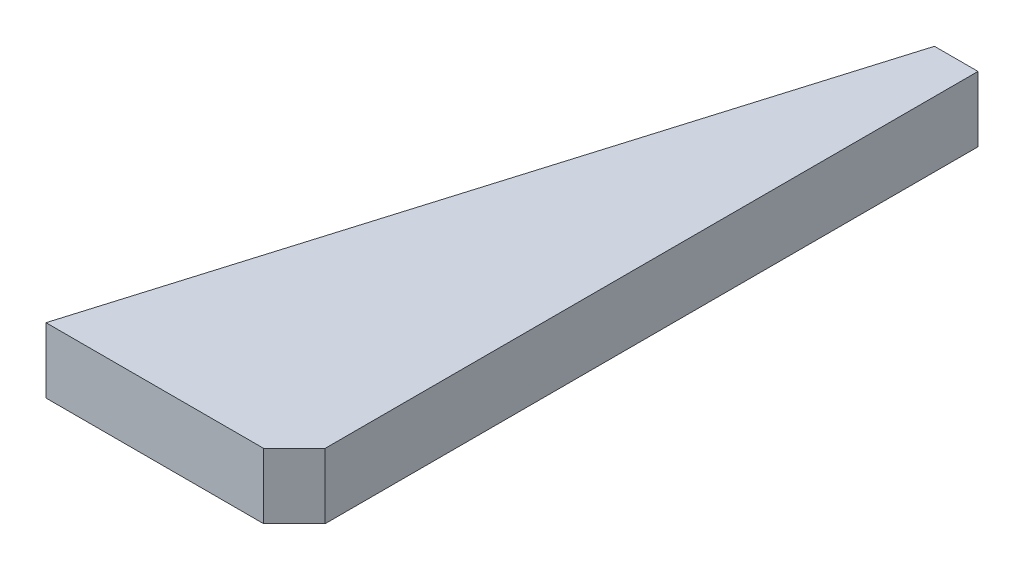
ISO-10303-21;
HEADER;
FILE_DESCRIPTION(('STEP AP214'),'2;1');
FILE_NAME('part.step','',(''),(''),'','','');
FILE_SCHEMA(('AUTOMOTIVE_DESIGN { 1 0 10303 214 1 1 1 1 }'));
ENDSEC;
DATA;
#1=APPLICATION_CONTEXT('core data for automotive mechanical design processes');
#2=APPLICATION_PROTOCOL_DEFINITION('international standard','automotive_design',2000,#1);
#3=PRODUCT_CONTEXT('',#1,'mechanical');
#4=PRODUCT('Part','Part','',(#3));
#5=PRODUCT_RELATED_PRODUCT_CATEGORY('part','',(#4));
#6=PRODUCT_DEFINITION_FORMATION('','',#4);
#7=PRODUCT_DEFINITION_CONTEXT('part definition',#1,'design');
#8=PRODUCT_DEFINITION('design','',#6,#7);
#9=PRODUCT_DEFINITION_SHAPE('','',#8);
#10=(LENGTH_UNIT() NAMED_UNIT(*) SI_UNIT(.MILLI.,.METRE.));
#11=(NAMED_UNIT(*) PLANE_ANGLE_UNIT() SI_UNIT($,.RADIAN.));
#12=(NAMED_UNIT(*) SI_UNIT($,.STERADIAN.) SOLID_ANGLE_UNIT());
#13=UNCERTAINTY_MEASURE_WITH_UNIT(LENGTH_MEASURE(1.E-05),#10,'distance_accuracy_value','');
#14=(GEOMETRIC_REPRESENTATION_CONTEXT(3) GLOBAL_UNCERTAINTY_ASSIGNED_CONTEXT((#13)) GLOBAL_UNIT_ASSIGNED_CONTEXT((#10,
#11,#12)) REPRESENTATION_CONTEXT('',''));
#15=CARTESIAN_POINT('',(0.,0.,0.));
#16=DIRECTION('',(0.,0.,1.));
#17=DIRECTION('',(1.,0.,0.));
#18=AXIS2_PLACEMENT_3D('',#15,#16,#17);
#19=CARTESIAN_POINT('',(0.,15.,0.));
#20=DIRECTION('',(0.,0.,1.));
#21=DIRECTION('',(1.,0.,0.));
#22=AXIS2_PLACEMENT_3D('',#19,#20,#21);
#23=PLANE('',#22);
#24=DIRECTION('',(-1.,0.,0.));
#25=VECTOR('',#24,1.);
#26=CARTESIAN_POINT('',(0.,0.,0.));
#27=LINE('',#26,#25);
#28=CARTESIAN_POINT('',(0.,0.,0.));
#29=VERTEX_POINT('',#28);
#30=CARTESIAN_POINT('',(-10.,0.,0.));
#31=VERTEX_POINT('',#30);
#32=EDGE_CURVE('E107',#29,#31,#27,.T.);
#33=ORIENTED_EDGE('',*,*,#32,.T.);
#34=DIRECTION('',(0.,-1.,0.));
#35=VECTOR('',#34,1.);
#36=CARTESIAN_POINT('',(-10.,15.,0.));
#37=LINE('',#36,#35);
#38=CARTESIAN_POINT('',(-10.,15.,0.));
#39=VERTEX_POINT('',#38);
#40=EDGE_CURVE('E11',#39,#31,#37,.T.);
#41=ORIENTED_EDGE('',*,*,#40,.F.);
#42=DIRECTION('',(-1.,0.,0.));
#43=VECTOR('',#42,1.);
#44=CARTESIAN_POINT('',(0.,15.,0.));
#45=LINE('',#44,#43);
#46=CARTESIAN_POINT('',(0.,15.,0.));
#47=VERTEX_POINT('',#46);
#48=EDGE_CURVE('E115',#47,#39,#45,.T.);
#49=ORIENTED_EDGE('',*,*,#48,.F.);
#50=DIRECTION('',(0.,-1.,0.));
#51=VECTOR('',#50,1.);
#52=CARTESIAN_POINT('',(0.,15.,0.));
#53=LINE('',#52,#51);
#54=EDGE_CURVE('E103',#47,#29,#53,.T.);
#55=ORIENTED_EDGE('',*,*,#54,.T.);
#56=EDGE_LOOP('',(#33,#41,#49,#55));
#57=FACE_BOUND('',#56,.T.);
#58=ADVANCED_FACE('F33',(#57),#23,.F.);
#59=CARTESIAN_POINT('',(-10.,15.,0.));
#60=DIRECTION('',(0.957910593254064,0.,0.28706670885292));
#61=DIRECTION('',(0.28706670885292,0.,-0.957910593254064));
#62=AXIS2_PLACEMENT_3D('',#59,#60,#61);
#63=PLANE('',#62);
#64=DIRECTION('',(-0.28706670885292,0.,0.957910593254064));
#65=VECTOR('',#64,1.);
#66=CARTESIAN_POINT('',(-10.,0.,0.));
#67=LINE('',#66,#65);
#68=CARTESIAN_POINT('',(-57.0710678118653,0.,157.071067811866));
#69=VERTEX_POINT('',#68);
#70=EDGE_CURVE('E110',#31,#69,#67,.T.);
#71=ORIENTED_EDGE('',*,*,#70,.T.);
#72=DIRECTION('',(0.,-1.,0.));
#73=VECTOR('',#72,1.);
#74=CARTESIAN_POINT('',(-57.0710678118653,15.,157.071067811866));
#75=LINE('',#74,#73);
#76=CARTESIAN_POINT('',(-57.0710678118653,15.,157.071067811866));
#77=VERTEX_POINT('',#76);
#78=EDGE_CURVE('E41',#77,#69,#75,.T.);
#79=ORIENTED_EDGE('',*,*,#78,.F.);
#80=DIRECTION('',(-0.28706670885292,0.,0.957910593254064));
#81=VECTOR('',#80,1.);
#82=CARTESIAN_POINT('',(-10.,15.,0.));
#83=LINE('',#82,#81);
#84=EDGE_CURVE('E83',#39,#77,#83,.T.);
#85=ORIENTED_EDGE('',*,*,#84,.F.);
#86=ORIENTED_EDGE('',*,*,#40,.T.);
#87=EDGE_LOOP('',(#71,#79,#85,#86));
#88=FACE_BOUND('',#87,.T.);
#89=ADVANCED_FACE('F134',(#88),#63,.F.);
#90=CARTESIAN_POINT('',(-7.07106781186529,15.,157.071067811866));
#91=DIRECTION('',(0.,0.,-1.));
#92=DIRECTION('',(-1.,0.,0.));
#93=AXIS2_PLACEMENT_3D('',#90,#91,#92);
#94=PLANE('',#93);
#95=DIRECTION('',(1.,0.,0.));
#96=VECTOR('',#95,1.);
#97=CARTESIAN_POINT('',(-7.07106781186529,0.,157.071067811866));
#98=LINE('',#97,#96);
#99=CARTESIAN_POINT('',(-7.07106781186529,0.,157.071067811866));
#100=VERTEX_POINT('',#99);
#101=EDGE_CURVE('E98',#69,#100,#98,.T.);
#102=ORIENTED_EDGE('',*,*,#101,.T.);
#103=DIRECTION('',(0.,-1.,0.));
#104=VECTOR('',#103,1.);
#105=CARTESIAN_POINT('',(-7.07106781186529,15.,157.071067811866));
#106=LINE('',#105,#104);
#107=CARTESIAN_POINT('',(-7.07106781186529,15.,157.071067811866));
#108=VERTEX_POINT('',#107);
#109=EDGE_CURVE('E95',#108,#100,#106,.T.);
#110=ORIENTED_EDGE('',*,*,#109,.F.);
#111=DIRECTION('',(1.,0.,0.));
#112=VECTOR('',#111,1.);
#113=CARTESIAN_POINT('',(-7.07106781186529,15.,157.071067811866));
#114=LINE('',#113,#112);
#115=EDGE_CURVE('E87',#77,#108,#114,.T.);
#116=ORIENTED_EDGE('',*,*,#115,.F.);
#117=ORIENTED_EDGE('',*,*,#78,.T.);
#118=EDGE_LOOP('',(#102,#110,#116,#117));
#119=FACE_BOUND('',#118,.T.);
#120=ADVANCED_FACE('F96',(#119),#94,.F.);
#121=CARTESIAN_POINT('',(0.,15.,150.));
#122=DIRECTION('',(-0.707106781186565,0.,-0.70710678118653));
#123=DIRECTION('',(-0.70710678118653,0.,0.707106781186565));
#124=AXIS2_PLACEMENT_3D('',#121,#122,#123);
#125=PLANE('',#124);
#126=DIRECTION('',(0.70710678118653,0.,-0.707106781186565));
#127=VECTOR('',#126,1.);
#128=CARTESIAN_POINT('',(0.,0.,150.));
#129=LINE('',#128,#127);
#130=CARTESIAN_POINT('',(0.,0.,150.));
#131=VERTEX_POINT('',#130);
#132=EDGE_CURVE('E69',#100,#131,#129,.T.);
#133=ORIENTED_EDGE('',*,*,#132,.T.);
#134=DIRECTION('',(0.,-1.,0.));
#135=VECTOR('',#134,1.);
#136=CARTESIAN_POINT('',(0.,15.,150.));
#137=LINE('',#136,#135);
#138=CARTESIAN_POINT('',(0.,15.,150.));
#139=VERTEX_POINT('',#138);
#140=EDGE_CURVE('E99',#139,#131,#137,.T.);
#141=ORIENTED_EDGE('',*,*,#140,.F.);
#142=DIRECTION('',(0.70710678118653,0.,-0.707106781186565));
#143=VECTOR('',#142,1.);
#144=CARTESIAN_POINT('',(0.,15.,150.));
#145=LINE('',#144,#143);
#146=EDGE_CURVE('E91',#108,#139,#145,.T.);
#147=ORIENTED_EDGE('',*,*,#146,.F.);
#148=ORIENTED_EDGE('',*,*,#109,.T.);
#149=EDGE_LOOP('',(#133,#141,#147,#148));
#150=FACE_BOUND('',#149,.T.);
#151=ADVANCED_FACE('F101',(#150),#125,.F.);
#152=CARTESIAN_POINT('',(0.,15.,0.));
#153=DIRECTION('',(-1.,0.,0.));
#154=DIRECTION('',(0.,0.,1.));
#155=AXIS2_PLACEMENT_3D('',#152,#153,#154);
#156=PLANE('',#155);
#157=DIRECTION('',(0.,0.,-1.));
#158=VECTOR('',#157,1.);
#159=CARTESIAN_POINT('',(0.,0.,0.));
#160=LINE('',#159,#158);
#161=EDGE_CURVE('E75',#131,#29,#160,.T.);
#162=ORIENTED_EDGE('',*,*,#161,.T.);
#163=ORIENTED_EDGE('',*,*,#54,.F.);
#164=DIRECTION('',(0.,0.,-1.));
#165=VECTOR('',#164,1.);
#166=CARTESIAN_POINT('',(0.,15.,0.));
#167=LINE('',#166,#165);
#168=EDGE_CURVE('E49',#139,#47,#167,.T.);
#169=ORIENTED_EDGE('',*,*,#168,.F.);
#170=ORIENTED_EDGE('',*,*,#140,.T.);
#171=EDGE_LOOP('',(#162,#163,#169,#170));
#172=FACE_BOUND('',#171,.T.);
#173=ADVANCED_FACE('F123',(#172),#156,.F.);
#174=CARTESIAN_POINT('',(0.,15.,0.));
#175=DIRECTION('',(0.,1.,0.));
#176=DIRECTION('',(0.,0.,1.));
#177=AXIS2_PLACEMENT_3D('',#174,#175,#176);
#178=PLANE('',#177);
#179=ORIENTED_EDGE('',*,*,#48,.T.);
#180=ORIENTED_EDGE('',*,*,#84,.T.);
#181=ORIENTED_EDGE('',*,*,#115,.T.);
#182=ORIENTED_EDGE('',*,*,#146,.T.);
#183=ORIENTED_EDGE('',*,*,#168,.T.);
#184=EDGE_LOOP('',(#179,#180,#181,#182,#183));
#185=FACE_BOUND('',#184,.T.);
#186=ADVANCED_FACE('F89',(#185),#178,.T.);
#187=CARTESIAN_POINT('',(0.,0.,0.));
#188=DIRECTION('',(0.,1.,0.));
#189=DIRECTION('',(0.,0.,1.));
#190=AXIS2_PLACEMENT_3D('',#187,#188,#189);
#191=PLANE('',#190);
#192=ORIENTED_EDGE('',*,*,#32,.F.);
#193=ORIENTED_EDGE('',*,*,#161,.F.);
#194=ORIENTED_EDGE('',*,*,#132,.F.);
#195=ORIENTED_EDGE('',*,*,#101,.F.);
#196=ORIENTED_EDGE('',*,*,#70,.F.);
#197=EDGE_LOOP('',(#192,#193,#194,#195,#196));
#198=FACE_BOUND('',#197,.T.);
#199=ADVANCED_FACE('F119',(#198),#191,.F.);
#200=CLOSED_SHELL('',(#58,#89,#120,#151,#173,#186,#199));
#201=MANIFOLD_SOLID_BREP('B2',#200);
#202=ADVANCED_BREP_SHAPE_REPRESENTATION('',(#18,#201),#14);
#203=SHAPE_DEFINITION_REPRESENTATION(#9,#202);
ENDSEC;
END-ISO-10303-21;
